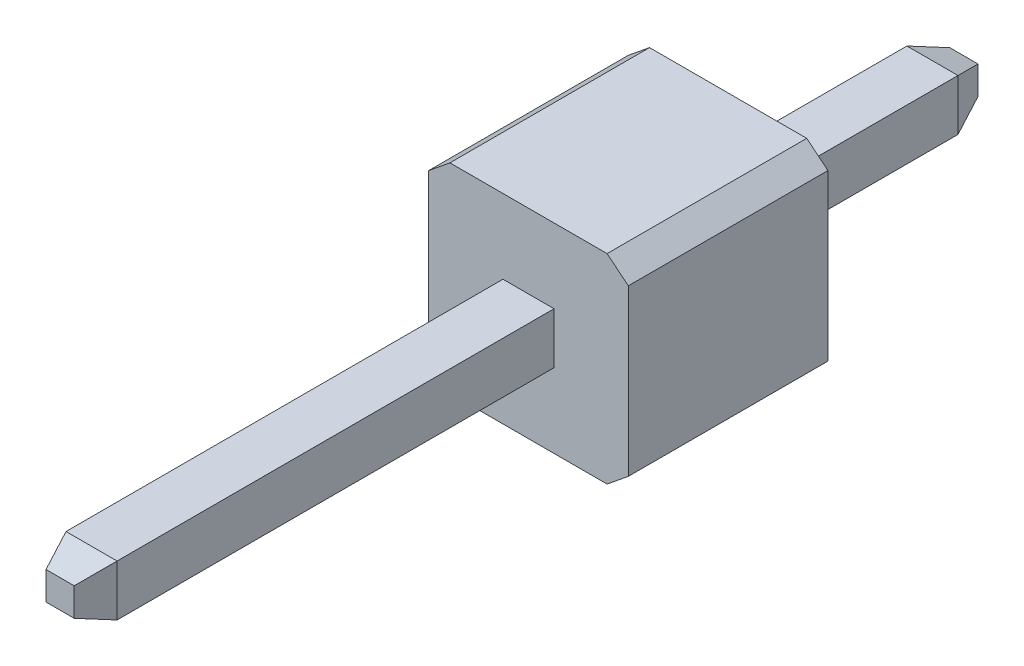
ISO-10303-21;
HEADER;
FILE_DESCRIPTION(('STEP AP214'),'2;1');
FILE_NAME('part.step','',(''),(''),'','','');
FILE_SCHEMA(('AUTOMOTIVE_DESIGN { 1 0 10303 214 1 1 1 1 }'));
ENDSEC;
DATA;
#1=APPLICATION_CONTEXT('core data for automotive mechanical design processes');
#2=APPLICATION_PROTOCOL_DEFINITION('international standard','automotive_design',2000,#1);
#3=PRODUCT_CONTEXT('',#1,'mechanical');
#4=PRODUCT('Part','Part','',(#3));
#5=PRODUCT_RELATED_PRODUCT_CATEGORY('part','',(#4));
#6=PRODUCT_DEFINITION_FORMATION('','',#4);
#7=PRODUCT_DEFINITION_CONTEXT('part definition',#1,'design');
#8=PRODUCT_DEFINITION('design','',#6,#7);
#9=PRODUCT_DEFINITION_SHAPE('','',#8);
#10=(LENGTH_UNIT() NAMED_UNIT(*) SI_UNIT(.MILLI.,.METRE.));
#11=(NAMED_UNIT(*) PLANE_ANGLE_UNIT() SI_UNIT($,.RADIAN.));
#12=(NAMED_UNIT(*) SI_UNIT($,.STERADIAN.) SOLID_ANGLE_UNIT());
#13=UNCERTAINTY_MEASURE_WITH_UNIT(LENGTH_MEASURE(1.E-05),#10,'distance_accuracy_value','');
#14=(GEOMETRIC_REPRESENTATION_CONTEXT(3) GLOBAL_UNCERTAINTY_ASSIGNED_CONTEXT((#13)) GLOBAL_UNIT_ASSIGNED_CONTEXT((#10,
#11,#12)) REPRESENTATION_CONTEXT('',''));
#15=CARTESIAN_POINT('',(0.,0.,0.));
#16=DIRECTION('',(0.,0.,1.));
#17=DIRECTION('',(1.,0.,0.));
#18=AXIS2_PLACEMENT_3D('',#15,#16,#17);
#19=CARTESIAN_POINT('',(-0.325,0.325,11.5));
#20=DIRECTION('',(1.,0.,0.));
#21=DIRECTION('',(0.,1.,0.));
#22=AXIS2_PLACEMENT_3D('',#19,#20,#21);
#23=PLANE('',#22);
#24=DIRECTION('',(0.,0.,-1.));
#25=VECTOR('',#24,1.);
#26=CARTESIAN_POINT('',(-0.325,0.325,11.5));
#27=LINE('',#26,#25);
#28=CARTESIAN_POINT('',(-0.325,0.325,11.1));
#29=VERTEX_POINT('',#28);
#30=CARTESIAN_POINT('',(-0.325,0.325,5.54));
#31=VERTEX_POINT('',#30);
#32=EDGE_CURVE('E268',#29,#31,#27,.T.);
#33=ORIENTED_EDGE('',*,*,#32,.T.);
#34=DIRECTION('',(0.,-1.,0.));
#35=VECTOR('',#34,1.);
#36=CARTESIAN_POINT('',(-0.325,0.325,5.54));
#37=LINE('',#36,#35);
#38=CARTESIAN_POINT('',(-0.325,-0.325,5.54));
#39=VERTEX_POINT('',#38);
#40=EDGE_CURVE('E264',#31,#39,#37,.T.);
#41=ORIENTED_EDGE('',*,*,#40,.T.);
#42=DIRECTION('',(0.,0.,-1.));
#43=VECTOR('',#42,1.);
#44=CARTESIAN_POINT('',(-0.325,-0.325,11.5));
#45=LINE('',#44,#43);
#46=CARTESIAN_POINT('',(-0.325,-0.325,11.1));
#47=VERTEX_POINT('',#46);
#48=EDGE_CURVE('E281',#47,#39,#45,.T.);
#49=ORIENTED_EDGE('',*,*,#48,.F.);
#50=DIRECTION('',(0.,1.,0.));
#51=VECTOR('',#50,1.);
#52=CARTESIAN_POINT('',(-0.325,0.325,11.1));
#53=LINE('',#52,#51);
#54=EDGE_CURVE('E300',#47,#29,#53,.T.);
#55=ORIENTED_EDGE('',*,*,#54,.T.);
#56=EDGE_LOOP('',(#33,#41,#49,#55));
#57=FACE_BOUND('',#56,.T.);
#58=ADVANCED_FACE('F38',(#57),#23,.F.);
#59=CARTESIAN_POINT('',(-0.325,-0.325,11.5));
#60=DIRECTION('',(0.,1.,0.));
#61=DIRECTION('',(0.,0.,1.));
#62=AXIS2_PLACEMENT_3D('',#59,#60,#61);
#63=PLANE('',#62);
#64=ORIENTED_EDGE('',*,*,#48,.T.);
#65=DIRECTION('',(1.,0.,0.));
#66=VECTOR('',#65,1.);
#67=CARTESIAN_POINT('',(-0.325,-0.325,5.54));
#68=LINE('',#67,#66);
#69=CARTESIAN_POINT('',(0.325,-0.325,5.54));
#70=VERTEX_POINT('',#69);
#71=EDGE_CURVE('E261',#39,#70,#68,.T.);
#72=ORIENTED_EDGE('',*,*,#71,.T.);
#73=DIRECTION('',(0.,0.,-1.));
#74=VECTOR('',#73,1.);
#75=CARTESIAN_POINT('',(0.325,-0.325,11.5));
#76=LINE('',#75,#74);
#77=CARTESIAN_POINT('',(0.325,-0.325,11.1));
#78=VERTEX_POINT('',#77);
#79=EDGE_CURVE('E277',#78,#70,#76,.T.);
#80=ORIENTED_EDGE('',*,*,#79,.F.);
#81=DIRECTION('',(-1.,0.,0.));
#82=VECTOR('',#81,1.);
#83=CARTESIAN_POINT('',(-0.325,-0.325,11.1));
#84=LINE('',#83,#82);
#85=EDGE_CURVE('E298',#78,#47,#84,.T.);
#86=ORIENTED_EDGE('',*,*,#85,.T.);
#87=EDGE_LOOP('',(#64,#72,#80,#86));
#88=FACE_BOUND('',#87,.T.);
#89=ADVANCED_FACE('F375',(#88),#63,.F.);
#90=CARTESIAN_POINT('',(0.325,0.325,11.5));
#91=DIRECTION('',(-1.,0.,0.));
#92=DIRECTION('',(0.,-1.,0.));
#93=AXIS2_PLACEMENT_3D('',#90,#91,#92);
#94=PLANE('',#93);
#95=ORIENTED_EDGE('',*,*,#79,.T.);
#96=DIRECTION('',(0.,1.,0.));
#97=VECTOR('',#96,1.);
#98=CARTESIAN_POINT('',(0.325,0.325,5.54));
#99=LINE('',#98,#97);
#100=CARTESIAN_POINT('',(0.325,0.325,5.54));
#101=VERTEX_POINT('',#100);
#102=EDGE_CURVE('E258',#70,#101,#99,.T.);
#103=ORIENTED_EDGE('',*,*,#102,.T.);
#104=DIRECTION('',(0.,0.,-1.));
#105=VECTOR('',#104,1.);
#106=CARTESIAN_POINT('',(0.325,0.325,11.5));
#107=LINE('',#106,#105);
#108=CARTESIAN_POINT('',(0.325,0.325,11.1));
#109=VERTEX_POINT('',#108);
#110=EDGE_CURVE('E273',#109,#101,#107,.T.);
#111=ORIENTED_EDGE('',*,*,#110,.F.);
#112=DIRECTION('',(0.,-1.,0.));
#113=VECTOR('',#112,1.);
#114=CARTESIAN_POINT('',(0.325,-0.325,11.1));
#115=LINE('',#114,#113);
#116=EDGE_CURVE('E296',#109,#78,#115,.T.);
#117=ORIENTED_EDGE('',*,*,#116,.T.);
#118=EDGE_LOOP('',(#95,#103,#111,#117));
#119=FACE_BOUND('',#118,.T.);
#120=ADVANCED_FACE('F382',(#119),#94,.F.);
#121=CARTESIAN_POINT('',(-0.325,0.325,11.5));
#122=DIRECTION('',(0.,-1.,0.));
#123=DIRECTION('',(0.,0.,-1.));
#124=AXIS2_PLACEMENT_3D('',#121,#122,#123);
#125=PLANE('',#124);
#126=ORIENTED_EDGE('',*,*,#110,.T.);
#127=DIRECTION('',(-1.,0.,0.));
#128=VECTOR('',#127,1.);
#129=CARTESIAN_POINT('',(-0.325,0.325,5.54));
#130=LINE('',#129,#128);
#131=EDGE_CURVE('E11',#101,#31,#130,.T.);
#132=ORIENTED_EDGE('',*,*,#131,.T.);
#133=ORIENTED_EDGE('',*,*,#32,.F.);
#134=DIRECTION('',(1.,0.,0.));
#135=VECTOR('',#134,1.);
#136=CARTESIAN_POINT('',(0.325,0.325,11.1));
#137=LINE('',#136,#135);
#138=EDGE_CURVE('E293',#29,#109,#137,.T.);
#139=ORIENTED_EDGE('',*,*,#138,.T.);
#140=EDGE_LOOP('',(#126,#132,#133,#139));
#141=FACE_BOUND('',#140,.T.);
#142=ADVANCED_FACE('F444',(#141),#125,.F.);
#143=CARTESIAN_POINT('',(0.,0.,11.5));
#144=DIRECTION('',(0.,0.,1.));
#145=DIRECTION('',(1.,0.,0.));
#146=AXIS2_PLACEMENT_3D('',#143,#144,#145);
#147=PLANE('',#146);
#148=DIRECTION('',(0.,1.,0.));
#149=VECTOR('',#148,1.);
#150=CARTESIAN_POINT('',(0.17941190629352,0.325,11.5));
#151=LINE('',#150,#149);
#152=CARTESIAN_POINT('',(0.17941190629352,-0.17941190629352,11.5));
#153=VERTEX_POINT('',#152);
#154=CARTESIAN_POINT('',(0.17941190629352,0.17941190629352,11.5));
#155=VERTEX_POINT('',#154);
#156=EDGE_CURVE('E288',#153,#155,#151,.T.);
#157=ORIENTED_EDGE('',*,*,#156,.T.);
#158=DIRECTION('',(-1.,0.,0.));
#159=VECTOR('',#158,1.);
#160=CARTESIAN_POINT('',(-0.325,0.17941190629352,11.5));
#161=LINE('',#160,#159);
#162=CARTESIAN_POINT('',(-0.17941190629352,0.17941190629352,11.5));
#163=VERTEX_POINT('',#162);
#164=EDGE_CURVE('E290',#155,#163,#161,.T.);
#165=ORIENTED_EDGE('',*,*,#164,.T.);
#166=DIRECTION('',(0.,-1.,0.));
#167=VECTOR('',#166,1.);
#168=CARTESIAN_POINT('',(-0.17941190629352,-0.325,11.5));
#169=LINE('',#168,#167);
#170=CARTESIAN_POINT('',(-0.17941190629352,-0.17941190629352,11.5));
#171=VERTEX_POINT('',#170);
#172=EDGE_CURVE('E284',#163,#171,#169,.T.);
#173=ORIENTED_EDGE('',*,*,#172,.T.);
#174=DIRECTION('',(1.,0.,0.));
#175=VECTOR('',#174,1.);
#176=CARTESIAN_POINT('',(0.325,-0.17941190629352,11.5));
#177=LINE('',#176,#175);
#178=EDGE_CURVE('E286',#171,#153,#177,.T.);
#179=ORIENTED_EDGE('',*,*,#178,.T.);
#180=EDGE_LOOP('',(#157,#165,#173,#179));
#181=FACE_BOUND('',#180,.T.);
#182=ADVANCED_FACE('F417',(#181),#147,.T.);
#183=CARTESIAN_POINT('',(0.,-0.17941190629352,11.5));
#184=DIRECTION('',(0.,-0.939692620785909,0.342020143325667));
#185=DIRECTION('',(-1.,0.,0.));
#186=AXIS2_PLACEMENT_3D('',#183,#184,#185);
#187=PLANE('',#186);
#188=DIRECTION('',(0.323615577118183,0.323615577118183,0.88912649071599));
#189=VECTOR('',#188,1.);
#190=CARTESIAN_POINT('',(-0.160622628092037,-0.160622628092037,11.5516231175864));
#191=LINE('',#190,#189);
#192=EDGE_CURVE('E308',#47,#171,#191,.T.);
#193=ORIENTED_EDGE('',*,*,#192,.F.);
#194=ORIENTED_EDGE('',*,*,#85,.F.);
#195=DIRECTION('',(-0.323615577118183,0.323615577118183,0.88912649071599));
#196=VECTOR('',#195,1.);
#197=CARTESIAN_POINT('',(0.160622628092037,-0.160622628092037,11.5516231175864));
#198=LINE('',#197,#196);
#199=EDGE_CURVE('E311',#153,#78,#198,.F.);
#200=ORIENTED_EDGE('',*,*,#199,.F.);
#201=ORIENTED_EDGE('',*,*,#178,.F.);
#202=EDGE_LOOP('',(#193,#194,#200,#201));
#203=FACE_BOUND('',#202,.T.);
#204=ADVANCED_FACE('F411',(#203),#187,.T.);
#205=CARTESIAN_POINT('',(0.17941190629352,0.,11.5));
#206=DIRECTION('',(0.939692620785909,0.,0.342020143325667));
#207=DIRECTION('',(0.,-1.,0.));
#208=AXIS2_PLACEMENT_3D('',#205,#206,#207);
#209=PLANE('',#208);
#210=ORIENTED_EDGE('',*,*,#199,.T.);
#211=ORIENTED_EDGE('',*,*,#116,.F.);
#212=DIRECTION('',(-0.323615577118183,-0.323615577118183,0.88912649071599));
#213=VECTOR('',#212,1.);
#214=CARTESIAN_POINT('',(0.160622628092037,0.160622628092037,11.5516231175864));
#215=LINE('',#214,#213);
#216=EDGE_CURVE('E305',#155,#109,#215,.F.);
#217=ORIENTED_EDGE('',*,*,#216,.F.);
#218=ORIENTED_EDGE('',*,*,#156,.F.);
#219=EDGE_LOOP('',(#210,#211,#217,#218));
#220=FACE_BOUND('',#219,.T.);
#221=ADVANCED_FACE('F404',(#220),#209,.T.);
#222=CARTESIAN_POINT('',(-0.17941190629352,0.,11.5));
#223=DIRECTION('',(-0.939692620785909,0.,0.342020143325667));
#224=DIRECTION('',(0.,1.,0.));
#225=AXIS2_PLACEMENT_3D('',#222,#223,#224);
#226=PLANE('',#225);
#227=ORIENTED_EDGE('',*,*,#192,.T.);
#228=ORIENTED_EDGE('',*,*,#172,.F.);
#229=DIRECTION('',(-0.323615577118183,0.323615577118183,-0.88912649071599));
#230=VECTOR('',#229,1.);
#231=CARTESIAN_POINT('',(-0.160622628092037,0.160622628092037,11.5516231175864));
#232=LINE('',#231,#230);
#233=EDGE_CURVE('E303',#29,#163,#232,.F.);
#234=ORIENTED_EDGE('',*,*,#233,.F.);
#235=ORIENTED_EDGE('',*,*,#54,.F.);
#236=EDGE_LOOP('',(#227,#228,#234,#235));
#237=FACE_BOUND('',#236,.T.);
#238=ADVANCED_FACE('F397',(#237),#226,.T.);
#239=CARTESIAN_POINT('',(0.,0.17941190629352,11.5));
#240=DIRECTION('',(0.,0.939692620785909,0.342020143325667));
#241=DIRECTION('',(1.,0.,0.));
#242=AXIS2_PLACEMENT_3D('',#239,#240,#241);
#243=PLANE('',#242);
#244=ORIENTED_EDGE('',*,*,#216,.T.);
#245=ORIENTED_EDGE('',*,*,#138,.F.);
#246=ORIENTED_EDGE('',*,*,#233,.T.);
#247=ORIENTED_EDGE('',*,*,#164,.F.);
#248=EDGE_LOOP('',(#244,#245,#246,#247));
#249=FACE_BOUND('',#248,.T.);
#250=ADVANCED_FACE('F391',(#249),#243,.T.);
#251=CARTESIAN_POINT('',(0.,0.,5.54));
#252=DIRECTION('',(0.,0.,1.));
#253=DIRECTION('',(1.,0.,0.));
#254=AXIS2_PLACEMENT_3D('',#251,#252,#253);
#255=PLANE('',#254);
#256=DIRECTION('',(0.775234985517289,-0.631672951162236,0.));
#257=VECTOR('',#256,1.);
#258=CARTESIAN_POINT('',(1.27,1.05,5.54));
#259=LINE('',#258,#257);
#260=CARTESIAN_POINT('',(1.,1.27,5.54));
#261=VERTEX_POINT('',#260);
#262=CARTESIAN_POINT('',(1.27,1.05,5.54));
#263=VERTEX_POINT('',#262);
#264=EDGE_CURVE('E196',#261,#263,#259,.T.);
#265=ORIENTED_EDGE('',*,*,#264,.F.);
#266=DIRECTION('',(1.,0.,0.));
#267=VECTOR('',#266,1.);
#268=CARTESIAN_POINT('',(1.,1.27,5.54));
#269=LINE('',#268,#267);
#270=CARTESIAN_POINT('',(-1.,1.27,5.54));
#271=VERTEX_POINT('',#270);
#272=EDGE_CURVE('E188',#271,#261,#269,.T.);
#273=ORIENTED_EDGE('',*,*,#272,.F.);
#274=DIRECTION('',(0.775234985517289,0.631672951162236,0.));
#275=VECTOR('',#274,1.);
#276=CARTESIAN_POINT('',(-1.,1.27,5.54));
#277=LINE('',#276,#275);
#278=CARTESIAN_POINT('',(-1.27,1.05,5.54));
#279=VERTEX_POINT('',#278);
#280=EDGE_CURVE('E220',#279,#271,#277,.T.);
#281=ORIENTED_EDGE('',*,*,#280,.F.);
#282=DIRECTION('',(0.,1.,0.));
#283=VECTOR('',#282,1.);
#284=CARTESIAN_POINT('',(-1.27,1.05,5.54));
#285=LINE('',#284,#283);
#286=CARTESIAN_POINT('',(-1.27,-1.05,5.54));
#287=VERTEX_POINT('',#286);
#288=EDGE_CURVE('E217',#287,#279,#285,.T.);
#289=ORIENTED_EDGE('',*,*,#288,.F.);
#290=DIRECTION('',(-0.775234985517289,0.631672951162235,0.));
#291=VECTOR('',#290,1.);
#292=CARTESIAN_POINT('',(-1.27,-1.05,5.54));
#293=LINE('',#292,#291);
#294=CARTESIAN_POINT('',(-1.,-1.27,5.54));
#295=VERTEX_POINT('',#294);
#296=EDGE_CURVE('E214',#295,#287,#293,.T.);
#297=ORIENTED_EDGE('',*,*,#296,.F.);
#298=DIRECTION('',(-1.,0.,0.));
#299=VECTOR('',#298,1.);
#300=CARTESIAN_POINT('',(-1.,-1.27,5.54));
#301=LINE('',#300,#299);
#302=CARTESIAN_POINT('',(1.,-1.27,5.54));
#303=VERTEX_POINT('',#302);
#304=EDGE_CURVE('E211',#303,#295,#301,.T.);
#305=ORIENTED_EDGE('',*,*,#304,.F.);
#306=DIRECTION('',(-0.77523498551729,-0.631672951162235,0.));
#307=VECTOR('',#306,1.);
#308=CARTESIAN_POINT('',(1.,-1.27,5.54));
#309=LINE('',#308,#307);
#310=CARTESIAN_POINT('',(1.27,-1.05,5.54));
#311=VERTEX_POINT('',#310);
#312=EDGE_CURVE('E200',#311,#303,#309,.T.);
#313=ORIENTED_EDGE('',*,*,#312,.F.);
#314=DIRECTION('',(0.,-1.,0.));
#315=VECTOR('',#314,1.);
#316=CARTESIAN_POINT('',(1.27,-1.05,5.54));
#317=LINE('',#316,#315);
#318=EDGE_CURVE('E180',#263,#311,#317,.T.);
#319=ORIENTED_EDGE('',*,*,#318,.F.);
#320=EDGE_LOOP('',(#265,#273,#281,#289,#297,#305,#313,#319));
#321=FACE_BOUND('',#320,.T.);
#322=ORIENTED_EDGE('',*,*,#40,.F.);
#323=ORIENTED_EDGE('',*,*,#131,.F.);
#324=ORIENTED_EDGE('',*,*,#102,.F.);
#325=ORIENTED_EDGE('',*,*,#71,.F.);
#326=EDGE_LOOP('',(#322,#323,#324,#325));
#327=FACE_BOUND('',#326,.T.);
#328=ADVANCED_FACE('F193',(#321,#327),#255,.T.);
#329=CARTESIAN_POINT('',(0.,0.,3.));
#330=DIRECTION('',(0.,0.,1.));
#331=DIRECTION('',(1.,0.,0.));
#332=AXIS2_PLACEMENT_3D('',#329,#330,#331);
#333=PLANE('',#332);
#334=DIRECTION('',(0.775234985517289,-0.631672951162236,0.));
#335=VECTOR('',#334,1.);
#336=CARTESIAN_POINT('',(1.27,1.05,3.));
#337=LINE('',#336,#335);
#338=CARTESIAN_POINT('',(1.,1.27,3.));
#339=VERTEX_POINT('',#338);
#340=CARTESIAN_POINT('',(1.27,1.05,3.));
#341=VERTEX_POINT('',#340);
#342=EDGE_CURVE('E224',#339,#341,#337,.T.);
#343=ORIENTED_EDGE('',*,*,#342,.T.);
#344=DIRECTION('',(0.,-1.,0.));
#345=VECTOR('',#344,1.);
#346=CARTESIAN_POINT('',(1.27,-1.05,3.));
#347=LINE('',#346,#345);
#348=CARTESIAN_POINT('',(1.27,-1.05,3.));
#349=VERTEX_POINT('',#348);
#350=EDGE_CURVE('E182',#341,#349,#347,.T.);
#351=ORIENTED_EDGE('',*,*,#350,.T.);
#352=DIRECTION('',(-0.77523498551729,-0.631672951162235,0.));
#353=VECTOR('',#352,1.);
#354=CARTESIAN_POINT('',(1.,-1.27,3.));
#355=LINE('',#354,#353);
#356=CARTESIAN_POINT('',(1.,-1.27,3.));
#357=VERTEX_POINT('',#356);
#358=EDGE_CURVE('E227',#349,#357,#355,.T.);
#359=ORIENTED_EDGE('',*,*,#358,.T.);
#360=DIRECTION('',(-1.,0.,0.));
#361=VECTOR('',#360,1.);
#362=CARTESIAN_POINT('',(-1.,-1.27,3.));
#363=LINE('',#362,#361);
#364=CARTESIAN_POINT('',(-1.,-1.27,3.));
#365=VERTEX_POINT('',#364);
#366=EDGE_CURVE('E230',#357,#365,#363,.T.);
#367=ORIENTED_EDGE('',*,*,#366,.T.);
#368=DIRECTION('',(-0.775234985517289,0.631672951162235,0.));
#369=VECTOR('',#368,1.);
#370=CARTESIAN_POINT('',(-1.27,-1.05,3.));
#371=LINE('',#370,#369);
#372=CARTESIAN_POINT('',(-1.27,-1.05,3.));
#373=VERTEX_POINT('',#372);
#374=EDGE_CURVE('E233',#365,#373,#371,.T.);
#375=ORIENTED_EDGE('',*,*,#374,.T.);
#376=DIRECTION('',(0.,1.,0.));
#377=VECTOR('',#376,1.);
#378=CARTESIAN_POINT('',(-1.27,1.05,3.));
#379=LINE('',#378,#377);
#380=CARTESIAN_POINT('',(-1.27,1.05,3.));
#381=VERTEX_POINT('',#380);
#382=EDGE_CURVE('E236',#373,#381,#379,.T.);
#383=ORIENTED_EDGE('',*,*,#382,.T.);
#384=DIRECTION('',(0.775234985517289,0.631672951162236,0.));
#385=VECTOR('',#384,1.);
#386=CARTESIAN_POINT('',(-1.,1.27,3.));
#387=LINE('',#386,#385);
#388=CARTESIAN_POINT('',(-1.,1.27,3.));
#389=VERTEX_POINT('',#388);
#390=EDGE_CURVE('E207',#381,#389,#387,.T.);
#391=ORIENTED_EDGE('',*,*,#390,.T.);
#392=DIRECTION('',(1.,0.,0.));
#393=VECTOR('',#392,1.);
#394=CARTESIAN_POINT('',(1.,1.27,3.));
#395=LINE('',#394,#393);
#396=EDGE_CURVE('E204',#389,#339,#395,.T.);
#397=ORIENTED_EDGE('',*,*,#396,.T.);
#398=EDGE_LOOP('',(#343,#351,#359,#367,#375,#383,#391,#397));
#399=FACE_BOUND('',#398,.T.);
#400=DIRECTION('',(-1.,0.,0.));
#401=VECTOR('',#400,1.);
#402=CARTESIAN_POINT('',(-0.325,0.325,3.));
#403=LINE('',#402,#401);
#404=CARTESIAN_POINT('',(0.325,0.325,3.));
#405=VERTEX_POINT('',#404);
#406=CARTESIAN_POINT('',(-0.325,0.325,3.));
#407=VERTEX_POINT('',#406);
#408=EDGE_CURVE('E47',#405,#407,#403,.T.);
#409=ORIENTED_EDGE('',*,*,#408,.T.);
#410=DIRECTION('',(0.,-1.,0.));
#411=VECTOR('',#410,1.);
#412=CARTESIAN_POINT('',(-0.325,0.325,3.));
#413=LINE('',#412,#411);
#414=CARTESIAN_POINT('',(-0.325,-0.325,3.));
#415=VERTEX_POINT('',#414);
#416=EDGE_CURVE('E255',#407,#415,#413,.T.);
#417=ORIENTED_EDGE('',*,*,#416,.T.);
#418=DIRECTION('',(1.,0.,0.));
#419=VECTOR('',#418,1.);
#420=CARTESIAN_POINT('',(-0.325,-0.325,3.));
#421=LINE('',#420,#419);
#422=CARTESIAN_POINT('',(0.325,-0.325,3.));
#423=VERTEX_POINT('',#422);
#424=EDGE_CURVE('E54',#415,#423,#421,.T.);
#425=ORIENTED_EDGE('',*,*,#424,.T.);
#426=DIRECTION('',(0.,1.,0.));
#427=VECTOR('',#426,1.);
#428=CARTESIAN_POINT('',(0.325,0.325,3.));
#429=LINE('',#428,#427);
#430=EDGE_CURVE('E62',#423,#405,#429,.T.);
#431=ORIENTED_EDGE('',*,*,#430,.T.);
#432=EDGE_LOOP('',(#409,#417,#425,#431));
#433=FACE_BOUND('',#432,.T.);
#434=ADVANCED_FACE('F344',(#399,#433),#333,.F.);
#435=CARTESIAN_POINT('',(1.27,1.05,5.54));
#436=DIRECTION('',(0.631672951162236,0.775234985517289,0.));
#437=DIRECTION('',(-0.775234985517289,0.631672951162236,0.));
#438=AXIS2_PLACEMENT_3D('',#435,#436,#437);
#439=PLANE('',#438);
#440=ORIENTED_EDGE('',*,*,#342,.F.);
#441=DIRECTION('',(0.,0.,-1.));
#442=VECTOR('',#441,1.);
#443=CARTESIAN_POINT('',(1.,1.27,5.54));
#444=LINE('',#443,#442);
#445=EDGE_CURVE('E203',#261,#339,#444,.T.);
#446=ORIENTED_EDGE('',*,*,#445,.F.);
#447=ORIENTED_EDGE('',*,*,#264,.T.);
#448=DIRECTION('',(0.,0.,-1.));
#449=VECTOR('',#448,1.);
#450=CARTESIAN_POINT('',(1.27,1.05,5.54));
#451=LINE('',#450,#449);
#452=EDGE_CURVE('E177',#263,#341,#451,.T.);
#453=ORIENTED_EDGE('',*,*,#452,.T.);
#454=EDGE_LOOP('',(#440,#446,#447,#453));
#455=FACE_BOUND('',#454,.T.);
#456=ADVANCED_FACE('F202',(#455),#439,.T.);
#457=CARTESIAN_POINT('',(1.,1.27,5.54));
#458=DIRECTION('',(0.,1.,0.));
#459=DIRECTION('',(0.,0.,1.));
#460=AXIS2_PLACEMENT_3D('',#457,#458,#459);
#461=PLANE('',#460);
#462=ORIENTED_EDGE('',*,*,#396,.F.);
#463=DIRECTION('',(0.,0.,-1.));
#464=VECTOR('',#463,1.);
#465=CARTESIAN_POINT('',(-1.,1.27,5.54));
#466=LINE('',#465,#464);
#467=EDGE_CURVE('E242',#271,#389,#466,.T.);
#468=ORIENTED_EDGE('',*,*,#467,.F.);
#469=ORIENTED_EDGE('',*,*,#272,.T.);
#470=ORIENTED_EDGE('',*,*,#445,.T.);
#471=EDGE_LOOP('',(#462,#468,#469,#470));
#472=FACE_BOUND('',#471,.T.);
#473=ADVANCED_FACE('F476',(#472),#461,.T.);
#474=CARTESIAN_POINT('',(-1.,1.27,5.54));
#475=DIRECTION('',(-0.631672951162236,0.775234985517289,0.));
#476=DIRECTION('',(-0.775234985517289,-0.631672951162236,0.));
#477=AXIS2_PLACEMENT_3D('',#474,#475,#476);
#478=PLANE('',#477);
#479=ORIENTED_EDGE('',*,*,#390,.F.);
#480=DIRECTION('',(0.,0.,-1.));
#481=VECTOR('',#480,1.);
#482=CARTESIAN_POINT('',(-1.27,1.05,5.54));
#483=LINE('',#482,#481);
#484=EDGE_CURVE('E244',#279,#381,#483,.T.);
#485=ORIENTED_EDGE('',*,*,#484,.F.);
#486=ORIENTED_EDGE('',*,*,#280,.T.);
#487=ORIENTED_EDGE('',*,*,#467,.T.);
#488=EDGE_LOOP('',(#479,#485,#486,#487));
#489=FACE_BOUND('',#488,.T.);
#490=ADVANCED_FACE('F479',(#489),#478,.T.);
#491=CARTESIAN_POINT('',(-1.27,1.05,5.54));
#492=DIRECTION('',(-1.,0.,0.));
#493=DIRECTION('',(0.,0.,1.));
#494=AXIS2_PLACEMENT_3D('',#491,#492,#493);
#495=PLANE('',#494);
#496=ORIENTED_EDGE('',*,*,#382,.F.);
#497=DIRECTION('',(0.,0.,-1.));
#498=VECTOR('',#497,1.);
#499=CARTESIAN_POINT('',(-1.27,-1.05,5.54));
#500=LINE('',#499,#498);
#501=EDGE_CURVE('E246',#287,#373,#500,.T.);
#502=ORIENTED_EDGE('',*,*,#501,.F.);
#503=ORIENTED_EDGE('',*,*,#288,.T.);
#504=ORIENTED_EDGE('',*,*,#484,.T.);
#505=EDGE_LOOP('',(#496,#502,#503,#504));
#506=FACE_BOUND('',#505,.T.);
#507=ADVANCED_FACE('F483',(#506),#495,.T.);
#508=CARTESIAN_POINT('',(-1.27,-1.05,5.54));
#509=DIRECTION('',(-0.631672951162235,-0.775234985517289,0.));
#510=DIRECTION('',(0.77523498551729,-0.631672951162236,0.));
#511=AXIS2_PLACEMENT_3D('',#508,#509,#510);
#512=PLANE('',#511);
#513=ORIENTED_EDGE('',*,*,#374,.F.);
#514=DIRECTION('',(0.,0.,-1.));
#515=VECTOR('',#514,1.);
#516=CARTESIAN_POINT('',(-1.,-1.27,5.54));
#517=LINE('',#516,#515);
#518=EDGE_CURVE('E248',#295,#365,#517,.T.);
#519=ORIENTED_EDGE('',*,*,#518,.F.);
#520=ORIENTED_EDGE('',*,*,#296,.T.);
#521=ORIENTED_EDGE('',*,*,#501,.T.);
#522=EDGE_LOOP('',(#513,#519,#520,#521));
#523=FACE_BOUND('',#522,.T.);
#524=ADVANCED_FACE('F487',(#523),#512,.T.);
#525=CARTESIAN_POINT('',(-1.,-1.27,5.54));
#526=DIRECTION('',(0.,-1.,0.));
#527=DIRECTION('',(0.,0.,-1.));
#528=AXIS2_PLACEMENT_3D('',#525,#526,#527);
#529=PLANE('',#528);
#530=ORIENTED_EDGE('',*,*,#366,.F.);
#531=DIRECTION('',(0.,0.,-1.));
#532=VECTOR('',#531,1.);
#533=CARTESIAN_POINT('',(1.,-1.27,5.54));
#534=LINE('',#533,#532);
#535=EDGE_CURVE('E250',#303,#357,#534,.T.);
#536=ORIENTED_EDGE('',*,*,#535,.F.);
#537=ORIENTED_EDGE('',*,*,#304,.T.);
#538=ORIENTED_EDGE('',*,*,#518,.T.);
#539=EDGE_LOOP('',(#530,#536,#537,#538));
#540=FACE_BOUND('',#539,.T.);
#541=ADVANCED_FACE('F491',(#540),#529,.T.);
#542=CARTESIAN_POINT('',(1.,-1.27,5.54));
#543=DIRECTION('',(0.631672951162235,-0.77523498551729,0.));
#544=DIRECTION('',(0.77523498551729,0.631672951162235,0.));
#545=AXIS2_PLACEMENT_3D('',#542,#543,#544);
#546=PLANE('',#545);
#547=ORIENTED_EDGE('',*,*,#358,.F.);
#548=DIRECTION('',(0.,0.,-1.));
#549=VECTOR('',#548,1.);
#550=CARTESIAN_POINT('',(1.27,-1.05,5.54));
#551=LINE('',#550,#549);
#552=EDGE_CURVE('E187',#311,#349,#551,.T.);
#553=ORIENTED_EDGE('',*,*,#552,.F.);
#554=ORIENTED_EDGE('',*,*,#312,.T.);
#555=ORIENTED_EDGE('',*,*,#535,.T.);
#556=EDGE_LOOP('',(#547,#553,#554,#555));
#557=FACE_BOUND('',#556,.T.);
#558=ADVANCED_FACE('F439',(#557),#546,.T.);
#559=CARTESIAN_POINT('',(1.27,-1.05,5.54));
#560=DIRECTION('',(1.,0.,0.));
#561=DIRECTION('',(0.,0.,-1.));
#562=AXIS2_PLACEMENT_3D('',#559,#560,#561);
#563=PLANE('',#562);
#564=ORIENTED_EDGE('',*,*,#350,.F.);
#565=ORIENTED_EDGE('',*,*,#452,.F.);
#566=ORIENTED_EDGE('',*,*,#318,.T.);
#567=ORIENTED_EDGE('',*,*,#552,.T.);
#568=EDGE_LOOP('',(#564,#565,#566,#567));
#569=FACE_BOUND('',#568,.T.);
#570=ADVANCED_FACE('F179',(#569),#563,.T.);
#571=CARTESIAN_POINT('',(0.,0.,0.));
#572=DIRECTION('',(0.,0.,1.));
#573=DIRECTION('',(1.,0.,0.));
#574=AXIS2_PLACEMENT_3D('',#571,#572,#573);
#575=PLANE('',#574);
#576=DIRECTION('',(0.,-1.,0.));
#577=VECTOR('',#576,1.);
#578=CARTESIAN_POINT('',(0.17941190629352,0.,0.));
#579=LINE('',#578,#577);
#580=CARTESIAN_POINT('',(0.17941190629352,0.17941190629352,0.));
#581=VERTEX_POINT('',#580);
#582=CARTESIAN_POINT('',(0.179411906293521,-0.17941190629352,0.));
#583=VERTEX_POINT('',#582);
#584=EDGE_CURVE('E320',#581,#583,#579,.T.);
#585=ORIENTED_EDGE('',*,*,#584,.T.);
#586=DIRECTION('',(-1.,0.,0.));
#587=VECTOR('',#586,1.);
#588=CARTESIAN_POINT('',(0.,-0.17941190629352,0.));
#589=LINE('',#588,#587);
#590=CARTESIAN_POINT('',(-0.17941190629352,-0.17941190629352,0.));
#591=VERTEX_POINT('',#590);
#592=EDGE_CURVE('E322',#583,#591,#589,.T.);
#593=ORIENTED_EDGE('',*,*,#592,.T.);
#594=DIRECTION('',(0.,1.,0.));
#595=VECTOR('',#594,1.);
#596=CARTESIAN_POINT('',(-0.17941190629352,0.,0.));
#597=LINE('',#596,#595);
#598=CARTESIAN_POINT('',(-0.17941190629352,0.17941190629352,0.));
#599=VERTEX_POINT('',#598);
#600=EDGE_CURVE('E316',#591,#599,#597,.T.);
#601=ORIENTED_EDGE('',*,*,#600,.T.);
#602=DIRECTION('',(1.,0.,0.));
#603=VECTOR('',#602,1.);
#604=CARTESIAN_POINT('',(0.,0.17941190629352,0.));
#605=LINE('',#604,#603);
#606=EDGE_CURVE('E318',#599,#581,#605,.T.);
#607=ORIENTED_EDGE('',*,*,#606,.T.);
#608=EDGE_LOOP('',(#585,#593,#601,#607));
#609=FACE_BOUND('',#608,.T.);
#610=ADVANCED_FACE('F362',(#609),#575,.F.);
#611=CARTESIAN_POINT('',(-0.325,0.325,0.400000000000001));
#612=DIRECTION('',(0.93969262078591,0.,0.342020143325665));
#613=DIRECTION('',(0.,-1.,0.));
#614=AXIS2_PLACEMENT_3D('',#611,#612,#613);
#615=PLANE('',#614);
#616=DIRECTION('',(0.323615577118182,-0.323615577118182,-0.889126490715991));
#617=VECTOR('',#616,1.);
#618=CARTESIAN_POINT('',(-0.325,0.325,0.400000000000001));
#619=LINE('',#618,#617);
#620=CARTESIAN_POINT('',(-0.325,0.325,0.400000000000001));
#621=VERTEX_POINT('',#620);
#622=EDGE_CURVE('E306',#621,#599,#619,.T.);
#623=ORIENTED_EDGE('',*,*,#622,.T.);
#624=ORIENTED_EDGE('',*,*,#600,.F.);
#625=DIRECTION('',(-0.323615577118182,-0.323615577118182,0.889126490715991));
#626=VECTOR('',#625,1.);
#627=CARTESIAN_POINT('',(-0.256927422860203,-0.256927422860203,0.212972131424324));
#628=LINE('',#627,#626);
#629=CARTESIAN_POINT('',(-0.325,-0.325,0.400000000000001));
#630=VERTEX_POINT('',#629);
#631=EDGE_CURVE('E336',#630,#591,#628,.F.);
#632=ORIENTED_EDGE('',*,*,#631,.F.);
#633=DIRECTION('',(0.,-1.,0.));
#634=VECTOR('',#633,1.);
#635=CARTESIAN_POINT('',(-0.325,0.325,0.400000000000001));
#636=LINE('',#635,#634);
#637=EDGE_CURVE('E331',#621,#630,#636,.T.);
#638=ORIENTED_EDGE('',*,*,#637,.F.);
#639=EDGE_LOOP('',(#623,#624,#632,#638));
#640=FACE_BOUND('',#639,.T.);
#641=ADVANCED_FACE('F369',(#640),#615,.F.);
#642=CARTESIAN_POINT('',(-0.325,-0.325,0.400000000000001));
#643=DIRECTION('',(0.,0.93969262078591,0.342020143325665));
#644=DIRECTION('',(1.,0.,0.));
#645=AXIS2_PLACEMENT_3D('',#642,#643,#644);
#646=PLANE('',#645);
#647=ORIENTED_EDGE('',*,*,#631,.T.);
#648=ORIENTED_EDGE('',*,*,#592,.F.);
#649=DIRECTION('',(-0.323615577118182,0.323615577118182,-0.889126490715991));
#650=VECTOR('',#649,1.);
#651=CARTESIAN_POINT('',(0.256927422860203,-0.256927422860203,0.212972131424324));
#652=LINE('',#651,#650);
#653=CARTESIAN_POINT('',(0.325,-0.325,0.400000000000001));
#654=VERTEX_POINT('',#653);
#655=EDGE_CURVE('E267',#583,#654,#652,.F.);
#656=ORIENTED_EDGE('',*,*,#655,.T.);
#657=DIRECTION('',(1.,0.,0.));
#658=VECTOR('',#657,1.);
#659=CARTESIAN_POINT('',(-0.325,-0.325,0.400000000000001));
#660=LINE('',#659,#658);
#661=EDGE_CURVE('E302',#630,#654,#660,.T.);
#662=ORIENTED_EDGE('',*,*,#661,.F.);
#663=EDGE_LOOP('',(#647,#648,#656,#662));
#664=FACE_BOUND('',#663,.T.);
#665=ADVANCED_FACE('F364',(#664),#646,.F.);
#666=CARTESIAN_POINT('',(0.325,0.325,0.400000000000001));
#667=DIRECTION('',(-0.93969262078591,0.,0.342020143325665));
#668=DIRECTION('',(0.,1.,0.));
#669=AXIS2_PLACEMENT_3D('',#666,#667,#668);
#670=PLANE('',#669);
#671=DIRECTION('',(-0.323615577118182,-0.323615577118182,-0.889126490715991));
#672=VECTOR('',#671,1.);
#673=CARTESIAN_POINT('',(0.256927422860203,0.256927422860203,0.212972131424324));
#674=LINE('',#673,#672);
#675=CARTESIAN_POINT('',(0.325,0.325,0.400000000000001));
#676=VERTEX_POINT('',#675);
#677=EDGE_CURVE('E338',#581,#676,#674,.F.);
#678=ORIENTED_EDGE('',*,*,#677,.T.);
#679=DIRECTION('',(0.,1.,0.));
#680=VECTOR('',#679,1.);
#681=CARTESIAN_POINT('',(0.325,0.325,0.400000000000001));
#682=LINE('',#681,#680);
#683=EDGE_CURVE('E325',#654,#676,#682,.T.);
#684=ORIENTED_EDGE('',*,*,#683,.F.);
#685=ORIENTED_EDGE('',*,*,#655,.F.);
#686=ORIENTED_EDGE('',*,*,#584,.F.);
#687=EDGE_LOOP('',(#678,#684,#685,#686));
#688=FACE_BOUND('',#687,.T.);
#689=ADVANCED_FACE('F359',(#688),#670,.F.);
#690=CARTESIAN_POINT('',(-0.325,0.325,0.400000000000001));
#691=DIRECTION('',(0.,-0.93969262078591,0.342020143325665));
#692=DIRECTION('',(-1.,0.,0.));
#693=AXIS2_PLACEMENT_3D('',#690,#691,#692);
#694=PLANE('',#693);
#695=ORIENTED_EDGE('',*,*,#677,.F.);
#696=ORIENTED_EDGE('',*,*,#606,.F.);
#697=ORIENTED_EDGE('',*,*,#622,.F.);
#698=DIRECTION('',(-1.,0.,0.));
#699=VECTOR('',#698,1.);
#700=CARTESIAN_POINT('',(-0.325,0.325,0.400000000000001));
#701=LINE('',#700,#699);
#702=EDGE_CURVE('E328',#676,#621,#701,.T.);
#703=ORIENTED_EDGE('',*,*,#702,.F.);
#704=EDGE_LOOP('',(#695,#696,#697,#703));
#705=FACE_BOUND('',#704,.T.);
#706=ADVANCED_FACE('F41',(#705),#694,.F.);
#707=ORIENTED_EDGE('',*,*,#408,.F.);
#708=EDGE_CURVE('E271',#405,#676,#107,.T.);
#709=ORIENTED_EDGE('',*,*,#708,.T.);
#710=ORIENTED_EDGE('',*,*,#702,.T.);
#711=EDGE_CURVE('E272',#407,#621,#27,.T.);
#712=ORIENTED_EDGE('',*,*,#711,.F.);
#713=EDGE_LOOP('',(#707,#709,#710,#712));
#714=FACE_BOUND('',#713,.T.);
#715=ADVANCED_FACE('F347',(#714),#125,.F.);
#716=ORIENTED_EDGE('',*,*,#430,.F.);
#717=EDGE_CURVE('E276',#423,#654,#76,.T.);
#718=ORIENTED_EDGE('',*,*,#717,.T.);
#719=ORIENTED_EDGE('',*,*,#683,.T.);
#720=ORIENTED_EDGE('',*,*,#708,.F.);
#721=EDGE_LOOP('',(#716,#718,#719,#720));
#722=FACE_BOUND('',#721,.T.);
#723=ADVANCED_FACE('F348',(#722),#94,.F.);
#724=ORIENTED_EDGE('',*,*,#424,.F.);
#725=EDGE_CURVE('E280',#415,#630,#45,.T.);
#726=ORIENTED_EDGE('',*,*,#725,.T.);
#727=ORIENTED_EDGE('',*,*,#661,.T.);
#728=ORIENTED_EDGE('',*,*,#717,.F.);
#729=EDGE_LOOP('',(#724,#726,#727,#728));
#730=FACE_BOUND('',#729,.T.);
#731=ADVANCED_FACE('F372',(#730),#63,.F.);
#732=ORIENTED_EDGE('',*,*,#416,.F.);
#733=ORIENTED_EDGE('',*,*,#711,.T.);
#734=ORIENTED_EDGE('',*,*,#637,.T.);
#735=ORIENTED_EDGE('',*,*,#725,.F.);
#736=EDGE_LOOP('',(#732,#733,#734,#735));
#737=FACE_BOUND('',#736,.T.);
#738=ADVANCED_FACE('F371',(#737),#23,.F.);
#739=CLOSED_SHELL('',(#58,#89,#120,#142,#182,#204,#221,#238,#250,#328,#434,#456,#473,#490,#507,
#524,#541,#558,#570,#610,#641,#665,#689,#706,#715,#723,#731,#738));
#740=MANIFOLD_SOLID_BREP('B2',#739);
#741=ADVANCED_BREP_SHAPE_REPRESENTATION('',(#18,#740),#14);
#742=SHAPE_DEFINITION_REPRESENTATION(#9,#741);
ENDSEC;
END-ISO-10303-21;
